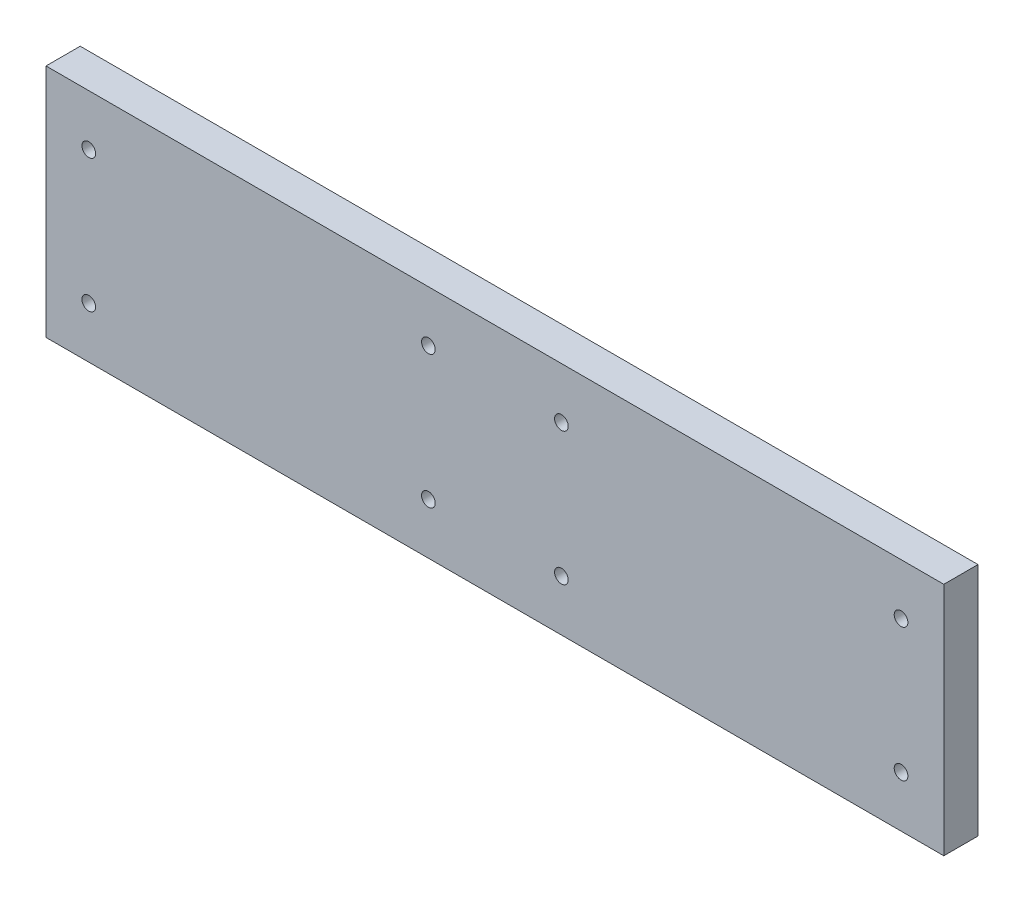
ISO-10303-21;
HEADER;
FILE_DESCRIPTION(('STEP AP214'),'2;1');
FILE_NAME('part.step','',(''),(''),'','','');
FILE_SCHEMA(('AUTOMOTIVE_DESIGN { 1 0 10303 214 1 1 1 1 }'));
ENDSEC;
DATA;
#1=APPLICATION_CONTEXT('core data for automotive mechanical design processes');
#2=APPLICATION_PROTOCOL_DEFINITION('international standard','automotive_design',2000,#1);
#3=PRODUCT_CONTEXT('',#1,'mechanical');
#4=PRODUCT('Part','Part','',(#3));
#5=PRODUCT_RELATED_PRODUCT_CATEGORY('part','',(#4));
#6=PRODUCT_DEFINITION_FORMATION('','',#4);
#7=PRODUCT_DEFINITION_CONTEXT('part definition',#1,'design');
#8=PRODUCT_DEFINITION('design','',#6,#7);
#9=PRODUCT_DEFINITION_SHAPE('','',#8);
#10=(LENGTH_UNIT() NAMED_UNIT(*) SI_UNIT(.MILLI.,.METRE.));
#11=(NAMED_UNIT(*) PLANE_ANGLE_UNIT() SI_UNIT($,.RADIAN.));
#12=(NAMED_UNIT(*) SI_UNIT($,.STERADIAN.) SOLID_ANGLE_UNIT());
#13=UNCERTAINTY_MEASURE_WITH_UNIT(LENGTH_MEASURE(1.E-05),#10,'distance_accuracy_value','');
#14=(GEOMETRIC_REPRESENTATION_CONTEXT(3) GLOBAL_UNCERTAINTY_ASSIGNED_CONTEXT((#13)) GLOBAL_UNIT_ASSIGNED_CONTEXT((#10,
#11,#12)) REPRESENTATION_CONTEXT('',''));
#15=CARTESIAN_POINT('',(0.,0.,0.));
#16=DIRECTION('',(0.,0.,1.));
#17=DIRECTION('',(1.,0.,0.));
#18=AXIS2_PLACEMENT_3D('',#15,#16,#17);
#19=CARTESIAN_POINT('',(-105.,-27.5,8.));
#20=DIRECTION('',(1.,0.,0.));
#21=DIRECTION('',(0.,0.,-1.));
#22=AXIS2_PLACEMENT_3D('',#19,#20,#21);
#23=PLANE('',#22);
#24=DIRECTION('',(0.,-1.,0.));
#25=VECTOR('',#24,1.);
#26=CARTESIAN_POINT('',(-105.,-27.5,0.));
#27=LINE('',#26,#25);
#28=CARTESIAN_POINT('',(-105.,27.5,0.));
#29=VERTEX_POINT('',#28);
#30=CARTESIAN_POINT('',(-105.,-27.5,0.));
#31=VERTEX_POINT('',#30);
#32=EDGE_CURVE('E114',#29,#31,#27,.T.);
#33=ORIENTED_EDGE('',*,*,#32,.T.);
#34=DIRECTION('',(0.,0.,-1.));
#35=VECTOR('',#34,1.);
#36=CARTESIAN_POINT('',(-105.,-27.5,8.));
#37=LINE('',#36,#35);
#38=CARTESIAN_POINT('',(-105.,-27.5,8.));
#39=VERTEX_POINT('',#38);
#40=EDGE_CURVE('E11',#39,#31,#37,.T.);
#41=ORIENTED_EDGE('',*,*,#40,.F.);
#42=DIRECTION('',(0.,-1.,0.));
#43=VECTOR('',#42,1.);
#44=CARTESIAN_POINT('',(-105.,-27.5,8.));
#45=LINE('',#44,#43);
#46=CARTESIAN_POINT('',(-105.,27.5,8.));
#47=VERTEX_POINT('',#46);
#48=EDGE_CURVE('E100',#47,#39,#45,.T.);
#49=ORIENTED_EDGE('',*,*,#48,.F.);
#50=DIRECTION('',(0.,0.,-1.));
#51=VECTOR('',#50,1.);
#52=CARTESIAN_POINT('',(-105.,27.5,8.));
#53=LINE('',#52,#51);
#54=EDGE_CURVE('E108',#47,#29,#53,.T.);
#55=ORIENTED_EDGE('',*,*,#54,.T.);
#56=EDGE_LOOP('',(#33,#41,#49,#55));
#57=FACE_BOUND('',#56,.T.);
#58=ADVANCED_FACE('F44',(#57),#23,.F.);
#59=CARTESIAN_POINT('',(-105.,-27.5,8.));
#60=DIRECTION('',(0.,1.,0.));
#61=DIRECTION('',(0.,0.,1.));
#62=AXIS2_PLACEMENT_3D('',#59,#60,#61);
#63=PLANE('',#62);
#64=DIRECTION('',(1.,0.,0.));
#65=VECTOR('',#64,1.);
#66=CARTESIAN_POINT('',(-105.,-27.5,0.));
#67=LINE('',#66,#65);
#68=CARTESIAN_POINT('',(105.,-27.5,0.));
#69=VERTEX_POINT('',#68);
#70=EDGE_CURVE('E105',#31,#69,#67,.T.);
#71=ORIENTED_EDGE('',*,*,#70,.T.);
#72=DIRECTION('',(0.,0.,-1.));
#73=VECTOR('',#72,1.);
#74=CARTESIAN_POINT('',(105.,-27.5,8.));
#75=LINE('',#74,#73);
#76=CARTESIAN_POINT('',(105.,-27.5,8.));
#77=VERTEX_POINT('',#76);
#78=EDGE_CURVE('E53',#77,#69,#75,.T.);
#79=ORIENTED_EDGE('',*,*,#78,.F.);
#80=DIRECTION('',(1.,0.,0.));
#81=VECTOR('',#80,1.);
#82=CARTESIAN_POINT('',(-105.,-27.5,8.));
#83=LINE('',#82,#81);
#84=EDGE_CURVE('E95',#39,#77,#83,.T.);
#85=ORIENTED_EDGE('',*,*,#84,.F.);
#86=ORIENTED_EDGE('',*,*,#40,.T.);
#87=EDGE_LOOP('',(#71,#79,#85,#86));
#88=FACE_BOUND('',#87,.T.);
#89=ADVANCED_FACE('F101',(#88),#63,.F.);
#90=CARTESIAN_POINT('',(105.,-27.5,8.));
#91=DIRECTION('',(-1.,0.,0.));
#92=DIRECTION('',(0.,0.,1.));
#93=AXIS2_PLACEMENT_3D('',#90,#91,#92);
#94=PLANE('',#93);
#95=DIRECTION('',(0.,1.,0.));
#96=VECTOR('',#95,1.);
#97=CARTESIAN_POINT('',(105.,-27.5,0.));
#98=LINE('',#97,#96);
#99=CARTESIAN_POINT('',(105.,27.5,0.));
#100=VERTEX_POINT('',#99);
#101=EDGE_CURVE('E76',#69,#100,#98,.T.);
#102=ORIENTED_EDGE('',*,*,#101,.T.);
#103=DIRECTION('',(0.,0.,-1.));
#104=VECTOR('',#103,1.);
#105=CARTESIAN_POINT('',(105.,27.5,8.));
#106=LINE('',#105,#104);
#107=CARTESIAN_POINT('',(105.,27.5,8.));
#108=VERTEX_POINT('',#107);
#109=EDGE_CURVE('E102',#108,#100,#106,.T.);
#110=ORIENTED_EDGE('',*,*,#109,.F.);
#111=DIRECTION('',(0.,1.,0.));
#112=VECTOR('',#111,1.);
#113=CARTESIAN_POINT('',(105.,-27.5,8.));
#114=LINE('',#113,#112);
#115=EDGE_CURVE('E92',#77,#108,#114,.T.);
#116=ORIENTED_EDGE('',*,*,#115,.F.);
#117=ORIENTED_EDGE('',*,*,#78,.T.);
#118=EDGE_LOOP('',(#102,#110,#116,#117));
#119=FACE_BOUND('',#118,.T.);
#120=ADVANCED_FACE('F104',(#119),#94,.F.);
#121=CARTESIAN_POINT('',(-105.,27.5,8.));
#122=DIRECTION('',(0.,-1.,0.));
#123=DIRECTION('',(0.,0.,-1.));
#124=AXIS2_PLACEMENT_3D('',#121,#122,#123);
#125=PLANE('',#124);
#126=DIRECTION('',(-1.,0.,0.));
#127=VECTOR('',#126,1.);
#128=CARTESIAN_POINT('',(-105.,27.5,0.));
#129=LINE('',#128,#127);
#130=EDGE_CURVE('E82',#100,#29,#129,.T.);
#131=ORIENTED_EDGE('',*,*,#130,.T.);
#132=ORIENTED_EDGE('',*,*,#54,.F.);
#133=DIRECTION('',(-1.,0.,0.));
#134=VECTOR('',#133,1.);
#135=CARTESIAN_POINT('',(-105.,27.5,8.));
#136=LINE('',#135,#134);
#137=EDGE_CURVE('E65',#108,#47,#136,.T.);
#138=ORIENTED_EDGE('',*,*,#137,.F.);
#139=ORIENTED_EDGE('',*,*,#109,.T.);
#140=EDGE_LOOP('',(#131,#132,#138,#139));
#141=FACE_BOUND('',#140,.T.);
#142=ADVANCED_FACE('F130',(#141),#125,.F.);
#143=CARTESIAN_POINT('',(0.,0.,8.));
#144=DIRECTION('',(0.,0.,-1.));
#145=DIRECTION('',(-1.,0.,0.));
#146=AXIS2_PLACEMENT_3D('',#143,#144,#145);
#147=PLANE('',#146);
#148=CARTESIAN_POINT('',(-95.,15.556349186104,8.));
#149=DIRECTION('',(0.,0.,-1.));
#150=DIRECTION('',(-1.,0.,0.));
#151=AXIS2_PLACEMENT_3D('',#148,#149,#150);
#152=CIRCLE('',#151,1.6);
#153=CARTESIAN_POINT('',(-96.6,15.556349186104,8.));
#154=VERTEX_POINT('',#153);
#155=EDGE_CURVE('E120',#154,#154,#152,.F.);
#156=ORIENTED_EDGE('',*,*,#155,.F.);
#157=EDGE_LOOP('',(#156));
#158=FACE_BOUND('',#157,.T.);
#159=CARTESIAN_POINT('',(15.556349186104,-15.556349186104,8.));
#160=DIRECTION('',(0.,0.,-1.));
#161=DIRECTION('',(-1.,0.,0.));
#162=AXIS2_PLACEMENT_3D('',#159,#160,#161);
#163=CIRCLE('',#162,1.59999999999999);
#164=CARTESIAN_POINT('',(13.9563491861041,-15.556349186104,8.));
#165=VERTEX_POINT('',#164);
#166=EDGE_CURVE('E136',#165,#165,#163,.F.);
#167=ORIENTED_EDGE('',*,*,#166,.F.);
#168=EDGE_LOOP('',(#167));
#169=FACE_BOUND('',#168,.T.);
#170=CARTESIAN_POINT('',(-15.556349186104,-15.556349186104,8.));
#171=DIRECTION('',(0.,0.,-1.));
#172=DIRECTION('',(-1.,0.,0.));
#173=AXIS2_PLACEMENT_3D('',#170,#171,#172);
#174=CIRCLE('',#173,1.6);
#175=CARTESIAN_POINT('',(-17.156349186104,-15.556349186104,8.));
#176=VERTEX_POINT('',#175);
#177=EDGE_CURVE('E143',#176,#176,#174,.F.);
#178=ORIENTED_EDGE('',*,*,#177,.F.);
#179=EDGE_LOOP('',(#178));
#180=FACE_BOUND('',#179,.T.);
#181=CARTESIAN_POINT('',(-15.556349186104,15.556349186104,8.));
#182=DIRECTION('',(0.,0.,-1.));
#183=DIRECTION('',(-1.,0.,0.));
#184=AXIS2_PLACEMENT_3D('',#181,#182,#183);
#185=CIRCLE('',#184,1.6);
#186=CARTESIAN_POINT('',(-17.156349186104,15.556349186104,8.));
#187=VERTEX_POINT('',#186);
#188=EDGE_CURVE('E144',#187,#187,#185,.F.);
#189=ORIENTED_EDGE('',*,*,#188,.F.);
#190=EDGE_LOOP('',(#189));
#191=FACE_BOUND('',#190,.T.);
#192=CARTESIAN_POINT('',(95.,-15.556349186104,8.));
#193=DIRECTION('',(0.,0.,-1.));
#194=DIRECTION('',(-1.,0.,0.));
#195=AXIS2_PLACEMENT_3D('',#192,#193,#194);
#196=CIRCLE('',#195,1.6);
#197=CARTESIAN_POINT('',(93.4,-15.556349186104,8.));
#198=VERTEX_POINT('',#197);
#199=EDGE_CURVE('E149',#198,#198,#196,.F.);
#200=ORIENTED_EDGE('',*,*,#199,.F.);
#201=EDGE_LOOP('',(#200));
#202=FACE_BOUND('',#201,.T.);
#203=CARTESIAN_POINT('',(95.,15.556349186104,8.));
#204=DIRECTION('',(0.,0.,-1.));
#205=DIRECTION('',(-1.,0.,0.));
#206=AXIS2_PLACEMENT_3D('',#203,#204,#205);
#207=CIRCLE('',#206,1.6);
#208=CARTESIAN_POINT('',(93.4,15.556349186104,8.));
#209=VERTEX_POINT('',#208);
#210=EDGE_CURVE('E153',#209,#209,#207,.F.);
#211=ORIENTED_EDGE('',*,*,#210,.F.);
#212=EDGE_LOOP('',(#211));
#213=FACE_BOUND('',#212,.T.);
#214=CARTESIAN_POINT('',(-95.,-15.556349186104,8.));
#215=DIRECTION('',(0.,0.,-1.));
#216=DIRECTION('',(-1.,0.,0.));
#217=AXIS2_PLACEMENT_3D('',#214,#215,#216);
#218=CIRCLE('',#217,1.6);
#219=CARTESIAN_POINT('',(-96.6,-15.556349186104,8.));
#220=VERTEX_POINT('',#219);
#221=EDGE_CURVE('E160',#220,#220,#218,.F.);
#222=ORIENTED_EDGE('',*,*,#221,.F.);
#223=EDGE_LOOP('',(#222));
#224=FACE_BOUND('',#223,.T.);
#225=CARTESIAN_POINT('',(15.556349186104,15.556349186104,8.));
#226=DIRECTION('',(0.,0.,-1.));
#227=DIRECTION('',(-1.,0.,0.));
#228=AXIS2_PLACEMENT_3D('',#225,#226,#227);
#229=CIRCLE('',#228,1.6);
#230=CARTESIAN_POINT('',(13.956349186104,15.556349186104,8.));
#231=VERTEX_POINT('',#230);
#232=EDGE_CURVE('E161',#231,#231,#229,.F.);
#233=ORIENTED_EDGE('',*,*,#232,.F.);
#234=EDGE_LOOP('',(#233));
#235=FACE_BOUND('',#234,.T.);
#236=ORIENTED_EDGE('',*,*,#48,.T.);
#237=ORIENTED_EDGE('',*,*,#84,.T.);
#238=ORIENTED_EDGE('',*,*,#115,.T.);
#239=ORIENTED_EDGE('',*,*,#137,.T.);
#240=EDGE_LOOP('',(#236,#237,#238,#239));
#241=FACE_BOUND('',#240,.T.);
#242=ADVANCED_FACE('F91',(#158,#169,#180,#191,#202,#213,#224,#235,#241),#147,.F.);
#243=CARTESIAN_POINT('',(0.,0.,0.));
#244=DIRECTION('',(0.,0.,-1.));
#245=DIRECTION('',(-1.,0.,0.));
#246=AXIS2_PLACEMENT_3D('',#243,#244,#245);
#247=PLANE('',#246);
#248=CARTESIAN_POINT('',(-95.,15.556349186104,0.));
#249=DIRECTION('',(0.,0.,1.));
#250=DIRECTION('',(1.,0.,0.));
#251=AXIS2_PLACEMENT_3D('',#248,#249,#250);
#252=CIRCLE('',#251,1.6);
#253=CARTESIAN_POINT('',(-93.4,15.556349186104,0.));
#254=VERTEX_POINT('',#253);
#255=EDGE_CURVE('E180',#254,#254,#252,.T.);
#256=ORIENTED_EDGE('',*,*,#255,.T.);
#257=EDGE_LOOP('',(#256));
#258=FACE_BOUND('',#257,.T.);
#259=CARTESIAN_POINT('',(15.556349186104,-15.556349186104,0.));
#260=DIRECTION('',(0.,0.,1.));
#261=DIRECTION('',(1.,0.,0.));
#262=AXIS2_PLACEMENT_3D('',#259,#260,#261);
#263=CIRCLE('',#262,1.59999999999999);
#264=CARTESIAN_POINT('',(17.156349186104,-15.556349186104,0.));
#265=VERTEX_POINT('',#264);
#266=EDGE_CURVE('E171',#265,#265,#263,.T.);
#267=ORIENTED_EDGE('',*,*,#266,.T.);
#268=EDGE_LOOP('',(#267));
#269=FACE_BOUND('',#268,.T.);
#270=CARTESIAN_POINT('',(-15.556349186104,-15.556349186104,0.));
#271=DIRECTION('',(0.,0.,1.));
#272=DIRECTION('',(1.,0.,0.));
#273=AXIS2_PLACEMENT_3D('',#270,#271,#272);
#274=CIRCLE('',#273,1.6);
#275=CARTESIAN_POINT('',(-13.956349186104,-15.556349186104,0.));
#276=VERTEX_POINT('',#275);
#277=EDGE_CURVE('E168',#276,#276,#274,.T.);
#278=ORIENTED_EDGE('',*,*,#277,.T.);
#279=EDGE_LOOP('',(#278));
#280=FACE_BOUND('',#279,.T.);
#281=CARTESIAN_POINT('',(-15.556349186104,15.556349186104,0.));
#282=DIRECTION('',(0.,0.,1.));
#283=DIRECTION('',(1.,0.,0.));
#284=AXIS2_PLACEMENT_3D('',#281,#282,#283);
#285=CIRCLE('',#284,1.6);
#286=CARTESIAN_POINT('',(-13.956349186104,15.556349186104,0.));
#287=VERTEX_POINT('',#286);
#288=EDGE_CURVE('E166',#287,#287,#285,.T.);
#289=ORIENTED_EDGE('',*,*,#288,.T.);
#290=EDGE_LOOP('',(#289));
#291=FACE_BOUND('',#290,.T.);
#292=CARTESIAN_POINT('',(95.,-15.556349186104,0.));
#293=DIRECTION('',(0.,0.,1.));
#294=DIRECTION('',(1.,0.,0.));
#295=AXIS2_PLACEMENT_3D('',#292,#293,#294);
#296=CIRCLE('',#295,1.6);
#297=CARTESIAN_POINT('',(96.6,-15.556349186104,0.));
#298=VERTEX_POINT('',#297);
#299=EDGE_CURVE('E188',#298,#298,#296,.T.);
#300=ORIENTED_EDGE('',*,*,#299,.T.);
#301=EDGE_LOOP('',(#300));
#302=FACE_BOUND('',#301,.T.);
#303=CARTESIAN_POINT('',(95.,15.556349186104,0.));
#304=DIRECTION('',(0.,0.,1.));
#305=DIRECTION('',(1.,0.,0.));
#306=AXIS2_PLACEMENT_3D('',#303,#304,#305);
#307=CIRCLE('',#306,1.6);
#308=CARTESIAN_POINT('',(96.6,15.556349186104,0.));
#309=VERTEX_POINT('',#308);
#310=EDGE_CURVE('E187',#309,#309,#307,.T.);
#311=ORIENTED_EDGE('',*,*,#310,.T.);
#312=EDGE_LOOP('',(#311));
#313=FACE_BOUND('',#312,.T.);
#314=CARTESIAN_POINT('',(-95.,-15.556349186104,0.));
#315=DIRECTION('',(0.,0.,1.));
#316=DIRECTION('',(1.,0.,0.));
#317=AXIS2_PLACEMENT_3D('',#314,#315,#316);
#318=CIRCLE('',#317,1.6);
#319=CARTESIAN_POINT('',(-93.4,-15.556349186104,0.));
#320=VERTEX_POINT('',#319);
#321=EDGE_CURVE('E185',#320,#320,#318,.T.);
#322=ORIENTED_EDGE('',*,*,#321,.T.);
#323=EDGE_LOOP('',(#322));
#324=FACE_BOUND('',#323,.T.);
#325=CARTESIAN_POINT('',(15.556349186104,15.556349186104,0.));
#326=DIRECTION('',(0.,0.,1.));
#327=DIRECTION('',(1.,0.,0.));
#328=AXIS2_PLACEMENT_3D('',#325,#326,#327);
#329=CIRCLE('',#328,1.6);
#330=CARTESIAN_POINT('',(17.156349186104,15.556349186104,0.));
#331=VERTEX_POINT('',#330);
#332=EDGE_CURVE('E164',#331,#331,#329,.T.);
#333=ORIENTED_EDGE('',*,*,#332,.T.);
#334=EDGE_LOOP('',(#333));
#335=FACE_BOUND('',#334,.T.);
#336=ORIENTED_EDGE('',*,*,#32,.F.);
#337=ORIENTED_EDGE('',*,*,#130,.F.);
#338=ORIENTED_EDGE('',*,*,#101,.F.);
#339=ORIENTED_EDGE('',*,*,#70,.F.);
#340=EDGE_LOOP('',(#336,#337,#338,#339));
#341=FACE_BOUND('',#340,.T.);
#342=ADVANCED_FACE('F128',(#258,#269,#280,#291,#302,#313,#324,#335,#341),#247,.T.);
#343=CARTESIAN_POINT('',(15.556349186104,15.556349186104,9.));
#344=DIRECTION('',(0.,0.,-1.));
#345=DIRECTION('',(-1.,0.,0.));
#346=AXIS2_PLACEMENT_3D('',#343,#344,#345);
#347=CYLINDRICAL_SURFACE('',#346,1.6);
#348=ORIENTED_EDGE('',*,*,#332,.F.);
#349=EDGE_LOOP('',(#348));
#350=FACE_BOUND('',#349,.T.);
#351=ORIENTED_EDGE('',*,*,#232,.T.);
#352=EDGE_LOOP('',(#351));
#353=FACE_BOUND('',#352,.T.);
#354=ADVANCED_FACE('F217',(#350,#353),#347,.F.);
#355=CARTESIAN_POINT('',(-95.,-15.556349186104,9.));
#356=DIRECTION('',(0.,0.,-1.));
#357=DIRECTION('',(-1.,0.,0.));
#358=AXIS2_PLACEMENT_3D('',#355,#356,#357);
#359=CYLINDRICAL_SURFACE('',#358,1.6);
#360=ORIENTED_EDGE('',*,*,#321,.F.);
#361=EDGE_LOOP('',(#360));
#362=FACE_BOUND('',#361,.T.);
#363=ORIENTED_EDGE('',*,*,#221,.T.);
#364=EDGE_LOOP('',(#363));
#365=FACE_BOUND('',#364,.T.);
#366=ADVANCED_FACE('F219',(#362,#365),#359,.F.);
#367=CARTESIAN_POINT('',(95.,15.556349186104,9.));
#368=DIRECTION('',(0.,0.,-1.));
#369=DIRECTION('',(-1.,0.,0.));
#370=AXIS2_PLACEMENT_3D('',#367,#368,#369);
#371=CYLINDRICAL_SURFACE('',#370,1.6);
#372=ORIENTED_EDGE('',*,*,#310,.F.);
#373=EDGE_LOOP('',(#372));
#374=FACE_BOUND('',#373,.T.);
#375=ORIENTED_EDGE('',*,*,#210,.T.);
#376=EDGE_LOOP('',(#375));
#377=FACE_BOUND('',#376,.T.);
#378=ADVANCED_FACE('F204',(#374,#377),#371,.F.);
#379=CARTESIAN_POINT('',(95.,-15.556349186104,9.));
#380=DIRECTION('',(0.,0.,-1.));
#381=DIRECTION('',(-1.,0.,0.));
#382=AXIS2_PLACEMENT_3D('',#379,#380,#381);
#383=CYLINDRICAL_SURFACE('',#382,1.6);
#384=ORIENTED_EDGE('',*,*,#299,.F.);
#385=EDGE_LOOP('',(#384));
#386=FACE_BOUND('',#385,.T.);
#387=ORIENTED_EDGE('',*,*,#199,.T.);
#388=EDGE_LOOP('',(#387));
#389=FACE_BOUND('',#388,.T.);
#390=ADVANCED_FACE('F199',(#386,#389),#383,.F.);
#391=CARTESIAN_POINT('',(-15.556349186104,15.556349186104,9.));
#392=DIRECTION('',(0.,0.,-1.));
#393=DIRECTION('',(-1.,0.,0.));
#394=AXIS2_PLACEMENT_3D('',#391,#392,#393);
#395=CYLINDRICAL_SURFACE('',#394,1.6);
#396=ORIENTED_EDGE('',*,*,#288,.F.);
#397=EDGE_LOOP('',(#396));
#398=FACE_BOUND('',#397,.T.);
#399=ORIENTED_EDGE('',*,*,#188,.T.);
#400=EDGE_LOOP('',(#399));
#401=FACE_BOUND('',#400,.T.);
#402=ADVANCED_FACE('F201',(#398,#401),#395,.F.);
#403=CARTESIAN_POINT('',(-15.556349186104,-15.556349186104,9.));
#404=DIRECTION('',(0.,0.,-1.));
#405=DIRECTION('',(-1.,0.,0.));
#406=AXIS2_PLACEMENT_3D('',#403,#404,#405);
#407=CYLINDRICAL_SURFACE('',#406,1.6);
#408=ORIENTED_EDGE('',*,*,#277,.F.);
#409=EDGE_LOOP('',(#408));
#410=FACE_BOUND('',#409,.T.);
#411=ORIENTED_EDGE('',*,*,#177,.T.);
#412=EDGE_LOOP('',(#411));
#413=FACE_BOUND('',#412,.T.);
#414=ADVANCED_FACE('F295',(#410,#413),#407,.F.);
#415=CARTESIAN_POINT('',(15.556349186104,-15.556349186104,9.));
#416=DIRECTION('',(0.,0.,-1.));
#417=DIRECTION('',(-1.,0.,0.));
#418=AXIS2_PLACEMENT_3D('',#415,#416,#417);
#419=CYLINDRICAL_SURFACE('',#418,1.59999999999999);
#420=ORIENTED_EDGE('',*,*,#266,.F.);
#421=EDGE_LOOP('',(#420));
#422=FACE_BOUND('',#421,.T.);
#423=ORIENTED_EDGE('',*,*,#166,.T.);
#424=EDGE_LOOP('',(#423));
#425=FACE_BOUND('',#424,.T.);
#426=ADVANCED_FACE('F301',(#422,#425),#419,.F.);
#427=CARTESIAN_POINT('',(-95.,15.556349186104,9.));
#428=DIRECTION('',(0.,0.,-1.));
#429=DIRECTION('',(-1.,0.,0.));
#430=AXIS2_PLACEMENT_3D('',#427,#428,#429);
#431=CYLINDRICAL_SURFACE('',#430,1.6);
#432=ORIENTED_EDGE('',*,*,#255,.F.);
#433=EDGE_LOOP('',(#432));
#434=FACE_BOUND('',#433,.T.);
#435=ORIENTED_EDGE('',*,*,#155,.T.);
#436=EDGE_LOOP('',(#435));
#437=FACE_BOUND('',#436,.T.);
#438=ADVANCED_FACE('F313',(#434,#437),#431,.F.);
#439=CLOSED_SHELL('',(#58,#89,#120,#142,#242,#342,#354,#366,#378,#390,#402,#414,#426,#438));
#440=MANIFOLD_SOLID_BREP('B2',#439);
#441=ADVANCED_BREP_SHAPE_REPRESENTATION('',(#18,#440),#14);
#442=SHAPE_DEFINITION_REPRESENTATION(#9,#441);
ENDSEC;
END-ISO-10303-21;
